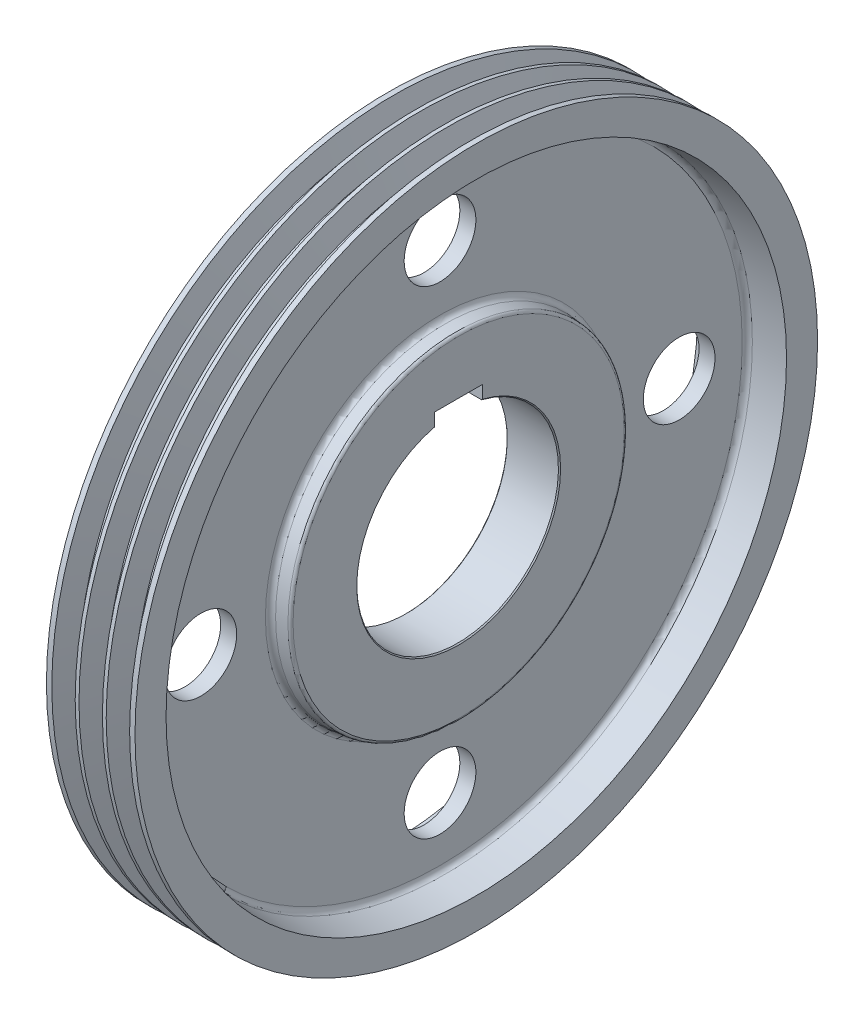
ISO-10303-21;
HEADER;
FILE_DESCRIPTION(('STEP AP214'),'2;1');
FILE_NAME('part.step','',(''),(''),'','','');
FILE_SCHEMA(('AUTOMOTIVE_DESIGN { 1 0 10303 214 1 1 1 1 }'));
ENDSEC;
DATA;
#1=APPLICATION_CONTEXT('core data for automotive mechanical design processes');
#2=APPLICATION_PROTOCOL_DEFINITION('international standard','automotive_design',2000,#1);
#3=PRODUCT_CONTEXT('',#1,'mechanical');
#4=PRODUCT('Part','Part','',(#3));
#5=PRODUCT_RELATED_PRODUCT_CATEGORY('part','',(#4));
#6=PRODUCT_DEFINITION_FORMATION('','',#4);
#7=PRODUCT_DEFINITION_CONTEXT('part definition',#1,'design');
#8=PRODUCT_DEFINITION('design','',#6,#7);
#9=PRODUCT_DEFINITION_SHAPE('','',#8);
#10=(LENGTH_UNIT() NAMED_UNIT(*) SI_UNIT(.MILLI.,.METRE.));
#11=(NAMED_UNIT(*) PLANE_ANGLE_UNIT() SI_UNIT($,.RADIAN.));
#12=(NAMED_UNIT(*) SI_UNIT($,.STERADIAN.) SOLID_ANGLE_UNIT());
#13=UNCERTAINTY_MEASURE_WITH_UNIT(LENGTH_MEASURE(1.E-05),#10,'distance_accuracy_value','');
#14=(GEOMETRIC_REPRESENTATION_CONTEXT(3) GLOBAL_UNCERTAINTY_ASSIGNED_CONTEXT((#13)) GLOBAL_UNIT_ASSIGNED_CONTEXT((#10,
#11,#12)) REPRESENTATION_CONTEXT('',''));
#15=CARTESIAN_POINT('',(0.,0.,0.));
#16=DIRECTION('',(0.,0.,1.));
#17=DIRECTION('',(1.,0.,0.));
#18=AXIS2_PLACEMENT_3D('',#15,#16,#17);
#19=CARTESIAN_POINT('',(34.,159.031051611703,0.));
#20=DIRECTION('',(1.,0.,0.));
#21=DIRECTION('',(0.,0.,-1.));
#22=AXIS2_PLACEMENT_3D('',#19,#20,#21);
#23=PLANE('',#22);
#24=CARTESIAN_POINT('',(34.,0.,0.));
#25=DIRECTION('',(1.,0.,0.));
#26=DIRECTION('',(0.,0.,-1.));
#27=AXIS2_PLACEMENT_3D('',#24,#25,#26);
#28=CIRCLE('',#27,163.612707481791);
#29=CARTESIAN_POINT('',(34.,0.,-163.612707481791));
#30=VERTEX_POINT('',#29);
#31=EDGE_CURVE('E375',#30,#30,#28,.T.);
#32=ORIENTED_EDGE('',*,*,#31,.T.);
#33=EDGE_LOOP('',(#32));
#34=FACE_BOUND('',#33,.T.);
#35=CARTESIAN_POINT('',(34.,0.,0.));
#36=DIRECTION('',(1.,0.,0.));
#37=DIRECTION('',(0.,0.,-1.));
#38=AXIS2_PLACEMENT_3D('',#35,#36,#37);
#39=CIRCLE('',#38,283.143729570031);
#40=CARTESIAN_POINT('',(34.,0.,-283.143729570031));
#41=VERTEX_POINT('',#40);
#42=EDGE_CURVE('E380',#41,#41,#39,.F.);
#43=ORIENTED_EDGE('',*,*,#42,.T.);
#44=EDGE_LOOP('',(#43));
#45=FACE_BOUND('',#44,.T.);
#46=CARTESIAN_POINT('',(34.,224.1,0.));
#47=DIRECTION('',(1.,0.,0.));
#48=DIRECTION('',(0.,0.,-1.));
#49=AXIS2_PLACEMENT_3D('',#46,#47,#48);
#50=CIRCLE('',#49,33.6);
#51=CARTESIAN_POINT('',(34.,224.1,-33.6));
#52=VERTEX_POINT('',#51);
#53=EDGE_CURVE('E403',#52,#52,#50,.F.);
#54=ORIENTED_EDGE('',*,*,#53,.F.);
#55=EDGE_LOOP('',(#54));
#56=FACE_BOUND('',#55,.T.);
#57=CARTESIAN_POINT('',(34.,-7.82440968034746E-13,-224.1));
#58=DIRECTION('',(1.,0.,0.));
#59=DIRECTION('',(0.,0.,-1.));
#60=AXIS2_PLACEMENT_3D('',#57,#58,#59);
#61=CIRCLE('',#60,33.6);
#62=CARTESIAN_POINT('',(34.,-7.82440968034746E-13,-257.7));
#63=VERTEX_POINT('',#62);
#64=EDGE_CURVE('E404',#63,#63,#61,.F.);
#65=ORIENTED_EDGE('',*,*,#64,.F.);
#66=EDGE_LOOP('',(#65));
#67=FACE_BOUND('',#66,.T.);
#68=CARTESIAN_POINT('',(34.,-224.1,1.56488193606949E-12));
#69=DIRECTION('',(1.,0.,0.));
#70=DIRECTION('',(0.,0.,-1.));
#71=AXIS2_PLACEMENT_3D('',#68,#69,#70);
#72=CIRCLE('',#71,33.6);
#73=CARTESIAN_POINT('',(34.,-224.1,-33.5999999999985));
#74=VERTEX_POINT('',#73);
#75=EDGE_CURVE('E407',#74,#74,#72,.F.);
#76=ORIENTED_EDGE('',*,*,#75,.F.);
#77=EDGE_LOOP('',(#76));
#78=FACE_BOUND('',#77,.T.);
#79=CARTESIAN_POINT('',(34.,2.34732290410424E-12,224.1));
#80=DIRECTION('',(1.,0.,0.));
#81=DIRECTION('',(0.,0.,-1.));
#82=AXIS2_PLACEMENT_3D('',#79,#80,#81);
#83=CIRCLE('',#82,33.6);
#84=CARTESIAN_POINT('',(34.,2.34732290410424E-12,190.5));
#85=VERTEX_POINT('',#84);
#86=EDGE_CURVE('E410',#85,#85,#83,.F.);
#87=ORIENTED_EDGE('',*,*,#86,.F.);
#88=EDGE_LOOP('',(#87));
#89=FACE_BOUND('',#88,.T.);
#90=ADVANCED_FACE('F39',(#34,#45,#56,#67,#78,#89),#23,.F.);
#91=CARTESIAN_POINT('',(49.,287.725385440119,0.));
#92=DIRECTION('',(-1.,0.,0.));
#93=DIRECTION('',(0.,0.,1.));
#94=AXIS2_PLACEMENT_3D('',#91,#92,#93);
#95=PLANE('',#94);
#96=CARTESIAN_POINT('',(49.,0.,0.));
#97=DIRECTION('',(-1.,0.,0.));
#98=DIRECTION('',(0.,0.,1.));
#99=AXIS2_PLACEMENT_3D('',#96,#97,#98);
#100=CIRCLE('',#99,163.612707481791);
#101=CARTESIAN_POINT('',(49.,0.,163.612707481791));
#102=VERTEX_POINT('',#101);
#103=EDGE_CURVE('E378',#102,#102,#100,.T.);
#104=ORIENTED_EDGE('',*,*,#103,.T.);
#105=EDGE_LOOP('',(#104));
#106=FACE_BOUND('',#105,.T.);
#107=CARTESIAN_POINT('',(49.,0.,0.));
#108=DIRECTION('',(-1.,0.,0.));
#109=DIRECTION('',(0.,0.,1.));
#110=AXIS2_PLACEMENT_3D('',#107,#108,#109);
#111=CIRCLE('',#110,283.143729570032);
#112=CARTESIAN_POINT('',(49.,0.,283.143729570032));
#113=VERTEX_POINT('',#112);
#114=EDGE_CURVE('E374',#113,#113,#111,.F.);
#115=ORIENTED_EDGE('',*,*,#114,.T.);
#116=EDGE_LOOP('',(#115));
#117=FACE_BOUND('',#116,.T.);
#118=CARTESIAN_POINT('',(49.,224.1,0.));
#119=DIRECTION('',(-1.,0.,0.));
#120=DIRECTION('',(0.,0.,1.));
#121=AXIS2_PLACEMENT_3D('',#118,#119,#120);
#122=CIRCLE('',#121,33.6);
#123=CARTESIAN_POINT('',(49.,224.1,33.6));
#124=VERTEX_POINT('',#123);
#125=EDGE_CURVE('E400',#124,#124,#122,.F.);
#126=ORIENTED_EDGE('',*,*,#125,.F.);
#127=EDGE_LOOP('',(#126));
#128=FACE_BOUND('',#127,.T.);
#129=CARTESIAN_POINT('',(49.,-7.82440968034746E-13,-224.1));
#130=DIRECTION('',(-1.,0.,0.));
#131=DIRECTION('',(0.,0.,1.));
#132=AXIS2_PLACEMENT_3D('',#129,#130,#131);
#133=CIRCLE('',#132,33.6);
#134=CARTESIAN_POINT('',(49.,-7.82440968034746E-13,-190.5));
#135=VERTEX_POINT('',#134);
#136=EDGE_CURVE('E405',#135,#135,#133,.F.);
#137=ORIENTED_EDGE('',*,*,#136,.F.);
#138=EDGE_LOOP('',(#137));
#139=FACE_BOUND('',#138,.T.);
#140=CARTESIAN_POINT('',(49.,-224.1,1.56488193606949E-12));
#141=DIRECTION('',(-1.,0.,0.));
#142=DIRECTION('',(0.,0.,1.));
#143=AXIS2_PLACEMENT_3D('',#140,#141,#142);
#144=CIRCLE('',#143,33.6);
#145=CARTESIAN_POINT('',(49.,-224.1,33.6000000000016));
#146=VERTEX_POINT('',#145);
#147=EDGE_CURVE('E408',#146,#146,#144,.F.);
#148=ORIENTED_EDGE('',*,*,#147,.F.);
#149=EDGE_LOOP('',(#148));
#150=FACE_BOUND('',#149,.T.);
#151=CARTESIAN_POINT('',(49.,2.34732290410424E-12,224.1));
#152=DIRECTION('',(-1.,0.,0.));
#153=DIRECTION('',(0.,0.,1.));
#154=AXIS2_PLACEMENT_3D('',#151,#152,#153);
#155=CIRCLE('',#154,33.6);
#156=CARTESIAN_POINT('',(49.,2.34732290410424E-12,257.7));
#157=VERTEX_POINT('',#156);
#158=EDGE_CURVE('E43',#157,#157,#155,.F.);
#159=ORIENTED_EDGE('',*,*,#158,.F.);
#160=EDGE_LOOP('',(#159));
#161=FACE_BOUND('',#160,.T.);
#162=ADVANCED_FACE('F196',(#106,#117,#128,#139,#150,#161),#95,.F.);
#163=CARTESIAN_POINT('',(0.,0.,0.));
#164=DIRECTION('',(-1.,0.,0.));
#165=DIRECTION('',(0.,0.,1.));
#166=AXIS2_PLACEMENT_3D('',#163,#164,#165);
#167=CYLINDRICAL_SURFACE('',#166,319.8);
#168=CARTESIAN_POINT('',(83.,0.,0.));
#169=DIRECTION('',(-1.,0.,0.));
#170=DIRECTION('',(0.,0.,1.));
#171=AXIS2_PLACEMENT_3D('',#168,#169,#170);
#172=CIRCLE('',#171,319.8);
#173=CARTESIAN_POINT('',(83.,0.,319.8));
#174=VERTEX_POINT('',#173);
#175=EDGE_CURVE('E249',#174,#174,#172,.T.);
#176=ORIENTED_EDGE('',*,*,#175,.T.);
#177=EDGE_LOOP('',(#176));
#178=FACE_BOUND('',#177,.T.);
#179=CARTESIAN_POINT('',(77.9675072710016,0.,0.));
#180=DIRECTION('',(-1.,0.,0.));
#181=DIRECTION('',(0.,0.,1.));
#182=AXIS2_PLACEMENT_3D('',#179,#180,#181);
#183=CIRCLE('',#182,319.8);
#184=CARTESIAN_POINT('',(77.9675072710016,0.,319.8));
#185=VERTEX_POINT('',#184);
#186=EDGE_CURVE('E282',#185,#185,#183,.T.);
#187=ORIENTED_EDGE('',*,*,#186,.F.);
#188=EDGE_LOOP('',(#187));
#189=FACE_BOUND('',#188,.T.);
#190=ADVANCED_FACE('F203',(#178,#189),#167,.T.);
#191=CARTESIAN_POINT('',(52.4675072710016,0.,0.));
#192=DIRECTION('',(-1.,0.,0.));
#193=DIRECTION('',(0.,0.,1.));
#194=AXIS2_PLACEMENT_3D('',#191,#192,#193);
#195=CIRCLE('',#194,319.8);
#196=CARTESIAN_POINT('',(52.4675072710016,0.,319.8));
#197=VERTEX_POINT('',#196);
#198=EDGE_CURVE('E270',#197,#197,#195,.T.);
#199=ORIENTED_EDGE('',*,*,#198,.F.);
#200=EDGE_LOOP('',(#199));
#201=FACE_BOUND('',#200,.T.);
#202=CARTESIAN_POINT('',(56.0324927289984,0.,0.));
#203=DIRECTION('',(-1.,0.,0.));
#204=DIRECTION('',(0.,0.,1.));
#205=AXIS2_PLACEMENT_3D('',#202,#203,#204);
#206=CIRCLE('',#205,319.8);
#207=CARTESIAN_POINT('',(56.0324927289984,0.,319.8));
#208=VERTEX_POINT('',#207);
#209=EDGE_CURVE('E285',#208,#208,#206,.T.);
#210=ORIENTED_EDGE('',*,*,#209,.T.);
#211=EDGE_LOOP('',(#210));
#212=FACE_BOUND('',#211,.T.);
#213=ADVANCED_FACE('F354',(#201,#212),#167,.T.);
#214=CARTESIAN_POINT('',(26.9675072710016,0.,0.));
#215=DIRECTION('',(-1.,0.,0.));
#216=DIRECTION('',(0.,0.,1.));
#217=AXIS2_PLACEMENT_3D('',#214,#215,#216);
#218=CIRCLE('',#217,319.8);
#219=CARTESIAN_POINT('',(26.9675072710016,0.,319.8));
#220=VERTEX_POINT('',#219);
#221=EDGE_CURVE('E258',#220,#220,#218,.T.);
#222=ORIENTED_EDGE('',*,*,#221,.F.);
#223=EDGE_LOOP('',(#222));
#224=FACE_BOUND('',#223,.T.);
#225=CARTESIAN_POINT('',(30.5324927289984,0.,0.));
#226=DIRECTION('',(-1.,0.,0.));
#227=DIRECTION('',(0.,0.,1.));
#228=AXIS2_PLACEMENT_3D('',#225,#226,#227);
#229=CIRCLE('',#228,319.8);
#230=CARTESIAN_POINT('',(30.5324927289984,0.,319.8));
#231=VERTEX_POINT('',#230);
#232=EDGE_CURVE('E273',#231,#231,#229,.T.);
#233=ORIENTED_EDGE('',*,*,#232,.T.);
#234=EDGE_LOOP('',(#233));
#235=FACE_BOUND('',#234,.T.);
#236=ADVANCED_FACE('F227',(#224,#235),#167,.T.);
#237=CARTESIAN_POINT('',(0.,0.,0.));
#238=DIRECTION('',(-1.,0.,0.));
#239=DIRECTION('',(0.,0.,1.));
#240=AXIS2_PLACEMENT_3D('',#237,#238,#239);
#241=CIRCLE('',#240,319.8);
#242=CARTESIAN_POINT('',(0.,0.,319.8));
#243=VERTEX_POINT('',#242);
#244=EDGE_CURVE('E246',#243,#243,#241,.T.);
#245=ORIENTED_EDGE('',*,*,#244,.F.);
#246=EDGE_LOOP('',(#245));
#247=FACE_BOUND('',#246,.T.);
#248=CARTESIAN_POINT('',(5.0324927289984,0.,0.));
#249=DIRECTION('',(-1.,0.,0.));
#250=DIRECTION('',(0.,0.,1.));
#251=AXIS2_PLACEMENT_3D('',#248,#249,#250);
#252=CIRCLE('',#251,319.8);
#253=CARTESIAN_POINT('',(5.0324927289984,0.,319.8));
#254=VERTEX_POINT('',#253);
#255=EDGE_CURVE('E261',#254,#254,#252,.T.);
#256=ORIENTED_EDGE('',*,*,#255,.T.);
#257=EDGE_LOOP('',(#256));
#258=FACE_BOUND('',#257,.T.);
#259=ADVANCED_FACE('F220',(#247,#258),#167,.T.);
#260=CARTESIAN_POINT('',(0.,0.,0.));
#261=DIRECTION('',(-1.,0.,0.));
#262=DIRECTION('',(0.,0.,1.));
#263=AXIS2_PLACEMENT_3D('',#260,#261,#262);
#264=CYLINDRICAL_SURFACE('',#263,94.5);
#265=CARTESIAN_POINT('',(17.5000000000001,0.,0.));
#266=DIRECTION('',(1.,0.,0.));
#267=DIRECTION('',(0.,0.,-1.));
#268=AXIS2_PLACEMENT_3D('',#265,#266,#267);
#269=CIRCLE('',#268,94.5);
#270=CARTESIAN_POINT('',(17.5000000000001,91.7823512446701,-22.5));
#271=VERTEX_POINT('',#270);
#272=CARTESIAN_POINT('',(17.5000000000001,91.7823512446701,22.5));
#273=VERTEX_POINT('',#272);
#274=EDGE_CURVE('E233',#271,#273,#269,.F.);
#275=ORIENTED_EDGE('',*,*,#274,.T.);
#276=DIRECTION('',(-1.,0.,0.));
#277=VECTOR('',#276,1.);
#278=CARTESIAN_POINT('',(83.,91.7823512446701,22.5));
#279=LINE('',#278,#277);
#280=CARTESIAN_POINT('',(65.5,91.7823512446701,22.5));
#281=VERTEX_POINT('',#280);
#282=EDGE_CURVE('E104',#281,#273,#279,.T.);
#283=ORIENTED_EDGE('',*,*,#282,.F.);
#284=CARTESIAN_POINT('',(65.5,0.,0.));
#285=DIRECTION('',(-1.,0.,0.));
#286=DIRECTION('',(0.,0.,1.));
#287=AXIS2_PLACEMENT_3D('',#284,#285,#286);
#288=CIRCLE('',#287,94.5);
#289=CARTESIAN_POINT('',(65.5,91.7823512446701,-22.5));
#290=VERTEX_POINT('',#289);
#291=EDGE_CURVE('E239',#281,#290,#288,.F.);
#292=ORIENTED_EDGE('',*,*,#291,.T.);
#293=DIRECTION('',(-1.,0.,0.));
#294=VECTOR('',#293,1.);
#295=CARTESIAN_POINT('',(83.,91.7823512446701,-22.5));
#296=LINE('',#295,#294);
#297=EDGE_CURVE('E117',#290,#271,#296,.T.);
#298=ORIENTED_EDGE('',*,*,#297,.T.);
#299=EDGE_LOOP('',(#275,#283,#292,#298));
#300=FACE_BOUND('',#299,.T.);
#301=ADVANCED_FACE('F217',(#300),#264,.F.);
#302=CARTESIAN_POINT('',(16.5,94.5,0.));
#303=DIRECTION('',(1.,0.,0.));
#304=DIRECTION('',(0.,0.,-1.));
#305=AXIS2_PLACEMENT_3D('',#302,#303,#304);
#306=PLANE('',#305);
#307=CARTESIAN_POINT('',(16.5,0.,0.));
#308=DIRECTION('',(1.,0.,0.));
#309=DIRECTION('',(0.,0.,-1.));
#310=AXIS2_PLACEMENT_3D('',#307,#308,#309);
#311=CIRCLE('',#310,155.209172064956);
#312=CARTESIAN_POINT('',(16.5,0.,-155.209172064956));
#313=VERTEX_POINT('',#312);
#314=EDGE_CURVE('E48',#313,#313,#311,.F.);
#315=ORIENTED_EDGE('',*,*,#314,.T.);
#316=EDGE_LOOP('',(#315));
#317=FACE_BOUND('',#316,.T.);
#318=CARTESIAN_POINT('',(16.5,0.,0.));
#319=DIRECTION('',(1.,0.,0.));
#320=DIRECTION('',(0.,0.,-1.));
#321=AXIS2_PLACEMENT_3D('',#318,#319,#320);
#322=CIRCLE('',#321,95.5000000000001);
#323=CARTESIAN_POINT('',(16.5,92.811637201377,22.5));
#324=VERTEX_POINT('',#323);
#325=CARTESIAN_POINT('',(16.5,92.811637201377,-22.5));
#326=VERTEX_POINT('',#325);
#327=EDGE_CURVE('E238',#324,#326,#322,.T.);
#328=ORIENTED_EDGE('',*,*,#327,.T.);
#329=DIRECTION('',(0.,-1.,0.));
#330=VECTOR('',#329,1.);
#331=CARTESIAN_POINT('',(16.5,91.7823512446701,-22.5));
#332=LINE('',#331,#330);
#333=CARTESIAN_POINT('',(16.5,104.89999961853,-22.5));
#334=VERTEX_POINT('',#333);
#335=EDGE_CURVE('E114',#334,#326,#332,.T.);
#336=ORIENTED_EDGE('',*,*,#335,.F.);
#337=DIRECTION('',(0.,0.,-1.));
#338=VECTOR('',#337,1.);
#339=CARTESIAN_POINT('',(16.5,104.89999961853,-22.5));
#340=LINE('',#339,#338);
#341=CARTESIAN_POINT('',(16.5,104.89999961853,22.5));
#342=VERTEX_POINT('',#341);
#343=EDGE_CURVE('E99',#342,#334,#340,.T.);
#344=ORIENTED_EDGE('',*,*,#343,.F.);
#345=DIRECTION('',(0.,1.,0.));
#346=VECTOR('',#345,1.);
#347=CARTESIAN_POINT('',(16.5,91.7823512446701,22.5));
#348=LINE('',#347,#346);
#349=EDGE_CURVE('E107',#324,#342,#348,.T.);
#350=ORIENTED_EDGE('',*,*,#349,.F.);
#351=EDGE_LOOP('',(#328,#336,#344,#350));
#352=FACE_BOUND('',#351,.T.);
#353=ADVANCED_FACE('F116',(#317,#352),#306,.F.);
#354=CARTESIAN_POINT('',(34.,0.,0.));
#355=DIRECTION('',(1.,0.,0.));
#356=DIRECTION('',(0.,0.,-1.));
#357=AXIS2_PLACEMENT_3D('',#354,#355,#356);
#358=CONICAL_SURFACE('',#357,159.031051611703,0.0872664625997021);
#359=CARTESIAN_POINT('',(18.7821106431312,0.,0.));
#360=DIRECTION('',(-1.,0.,0.));
#361=DIRECTION('',(0.,0.,1.));
#362=AXIS2_PLACEMENT_3D('',#359,#360,#361);
#363=CIRCLE('',#362,157.699658810186);
#364=CARTESIAN_POINT('',(18.7821106431312,0.,157.699658810186));
#365=VERTEX_POINT('',#364);
#366=EDGE_CURVE('E11',#365,#365,#363,.F.);
#367=ORIENTED_EDGE('',*,*,#366,.T.);
#368=EDGE_LOOP('',(#367));
#369=FACE_BOUND('',#368,.T.);
#370=CARTESIAN_POINT('',(29.4357787137382,0.,0.));
#371=DIRECTION('',(1.,0.,0.));
#372=DIRECTION('',(0.,0.,-1.));
#373=AXIS2_PLACEMENT_3D('',#370,#371,#372);
#374=CIRCLE('',#373,158.631733991332);
#375=CARTESIAN_POINT('',(29.4357787137382,0.,-158.631733991332));
#376=VERTEX_POINT('',#375);
#377=EDGE_CURVE('E710',#376,#376,#374,.F.);
#378=ORIENTED_EDGE('',*,*,#377,.T.);
#379=EDGE_LOOP('',(#378));
#380=FACE_BOUND('',#379,.T.);
#381=ADVANCED_FACE('F212',(#369,#380),#358,.T.);
#382=CARTESIAN_POINT('',(0.,0.,0.));
#383=DIRECTION('',(-1.,0.,0.));
#384=DIRECTION('',(0.,0.,1.));
#385=AXIS2_PLACEMENT_3D('',#382,#383,#384);
#386=CONICAL_SURFACE('',#385,290.7,0.0872664625997161);
#387=CARTESIAN_POINT('',(29.4357787137383,0.,0.));
#388=DIRECTION('',(-1.,0.,0.));
#389=DIRECTION('',(0.,0.,1.));
#390=AXIS2_PLACEMENT_3D('',#387,#388,#389);
#391=CIRCLE('',#390,288.12470306049);
#392=CARTESIAN_POINT('',(29.4357787137383,0.,288.12470306049));
#393=VERTEX_POINT('',#392);
#394=EDGE_CURVE('E373',#393,#393,#391,.F.);
#395=ORIENTED_EDGE('',*,*,#394,.T.);
#396=EDGE_LOOP('',(#395));
#397=FACE_BOUND('',#396,.T.);
#398=CARTESIAN_POINT('',(0.,0.,0.));
#399=DIRECTION('',(-1.,0.,0.));
#400=DIRECTION('',(0.,0.,1.));
#401=AXIS2_PLACEMENT_3D('',#398,#399,#400);
#402=CIRCLE('',#401,290.7);
#403=CARTESIAN_POINT('',(0.,0.,290.7));
#404=VERTEX_POINT('',#403);
#405=EDGE_CURVE('E241',#404,#404,#402,.T.);
#406=ORIENTED_EDGE('',*,*,#405,.T.);
#407=EDGE_LOOP('',(#406));
#408=FACE_BOUND('',#407,.T.);
#409=ADVANCED_FACE('F210',(#397,#408),#386,.F.);
#410=CARTESIAN_POINT('',(0.,290.7,0.));
#411=DIRECTION('',(1.,0.,0.));
#412=DIRECTION('',(0.,0.,-1.));
#413=AXIS2_PLACEMENT_3D('',#410,#411,#412);
#414=PLANE('',#413);
#415=ORIENTED_EDGE('',*,*,#405,.F.);
#416=EDGE_LOOP('',(#415));
#417=FACE_BOUND('',#416,.T.);
#418=ORIENTED_EDGE('',*,*,#244,.T.);
#419=EDGE_LOOP('',(#418));
#420=FACE_BOUND('',#419,.T.);
#421=ADVANCED_FACE('F351',(#417,#420),#414,.F.);
#422=CARTESIAN_POINT('',(83.,319.8,0.));
#423=DIRECTION('',(-1.,0.,0.));
#424=DIRECTION('',(0.,0.,1.));
#425=AXIS2_PLACEMENT_3D('',#422,#423,#424);
#426=PLANE('',#425);
#427=ORIENTED_EDGE('',*,*,#175,.F.);
#428=EDGE_LOOP('',(#427));
#429=FACE_BOUND('',#428,.T.);
#430=CARTESIAN_POINT('',(83.,0.,0.));
#431=DIRECTION('',(-1.,0.,0.));
#432=DIRECTION('',(0.,0.,1.));
#433=AXIS2_PLACEMENT_3D('',#430,#431,#432);
#434=CIRCLE('',#433,290.7);
#435=CARTESIAN_POINT('',(83.,0.,290.7));
#436=VERTEX_POINT('',#435);
#437=EDGE_CURVE('E252',#436,#436,#434,.T.);
#438=ORIENTED_EDGE('',*,*,#437,.T.);
#439=EDGE_LOOP('',(#438));
#440=FACE_BOUND('',#439,.T.);
#441=ADVANCED_FACE('F348',(#429,#440),#426,.F.);
#442=CARTESIAN_POINT('',(49.,0.,0.));
#443=DIRECTION('',(1.,0.,0.));
#444=DIRECTION('',(0.,0.,-1.));
#445=AXIS2_PLACEMENT_3D('',#442,#443,#444);
#446=CONICAL_SURFACE('',#445,287.725385440119,0.0872664625997015);
#447=CARTESIAN_POINT('',(53.5642212862618,0.,0.));
#448=DIRECTION('',(1.,0.,0.));
#449=DIRECTION('',(0.,0.,-1.));
#450=AXIS2_PLACEMENT_3D('',#447,#448,#449);
#451=CIRCLE('',#450,288.124703060491);
#452=CARTESIAN_POINT('',(53.5642212862618,0.,-288.124703060491));
#453=VERTEX_POINT('',#452);
#454=EDGE_CURVE('E389',#453,#453,#451,.F.);
#455=ORIENTED_EDGE('',*,*,#454,.T.);
#456=EDGE_LOOP('',(#455));
#457=FACE_BOUND('',#456,.T.);
#458=ORIENTED_EDGE('',*,*,#437,.F.);
#459=EDGE_LOOP('',(#458));
#460=FACE_BOUND('',#459,.T.);
#461=ADVANCED_FACE('F343',(#457,#460),#446,.F.);
#462=CARTESIAN_POINT('',(66.5,0.,0.));
#463=DIRECTION('',(-1.,0.,0.));
#464=DIRECTION('',(0.,0.,1.));
#465=AXIS2_PLACEMENT_3D('',#462,#463,#464);
#466=CONICAL_SURFACE('',#465,157.5,0.0872664625997162);
#467=CARTESIAN_POINT('',(64.2178893568692,0.,0.));
#468=DIRECTION('',(1.,0.,0.));
#469=DIRECTION('',(0.,0.,-1.));
#470=AXIS2_PLACEMENT_3D('',#467,#468,#469);
#471=CIRCLE('',#470,157.699658810186);
#472=CARTESIAN_POINT('',(64.2178893568692,0.,-157.699658810186));
#473=VERTEX_POINT('',#472);
#474=EDGE_CURVE('E392',#473,#473,#471,.F.);
#475=ORIENTED_EDGE('',*,*,#474,.T.);
#476=EDGE_LOOP('',(#475));
#477=FACE_BOUND('',#476,.T.);
#478=CARTESIAN_POINT('',(53.5642212862617,0.,0.));
#479=DIRECTION('',(-1.,0.,0.));
#480=DIRECTION('',(0.,0.,1.));
#481=AXIS2_PLACEMENT_3D('',#478,#479,#480);
#482=CIRCLE('',#481,158.631733991332);
#483=CARTESIAN_POINT('',(53.5642212862617,0.,158.631733991332));
#484=VERTEX_POINT('',#483);
#485=EDGE_CURVE('E386',#484,#484,#482,.F.);
#486=ORIENTED_EDGE('',*,*,#485,.T.);
#487=EDGE_LOOP('',(#486));
#488=FACE_BOUND('',#487,.T.);
#489=ADVANCED_FACE('F340',(#477,#488),#466,.T.);
#490=CARTESIAN_POINT('',(66.5,157.5,0.));
#491=DIRECTION('',(-1.,0.,0.));
#492=DIRECTION('',(0.,0.,1.));
#493=AXIS2_PLACEMENT_3D('',#490,#491,#492);
#494=PLANE('',#493);
#495=CARTESIAN_POINT('',(66.5,0.,0.));
#496=DIRECTION('',(-1.,0.,0.));
#497=DIRECTION('',(0.,0.,1.));
#498=AXIS2_PLACEMENT_3D('',#495,#496,#497);
#499=CIRCLE('',#498,155.209172064956);
#500=CARTESIAN_POINT('',(66.5,0.,155.209172064956));
#501=VERTEX_POINT('',#500);
#502=EDGE_CURVE('E395',#501,#501,#499,.F.);
#503=ORIENTED_EDGE('',*,*,#502,.T.);
#504=EDGE_LOOP('',(#503));
#505=FACE_BOUND('',#504,.T.);
#506=DIRECTION('',(0.,0.,-1.));
#507=VECTOR('',#506,1.);
#508=CARTESIAN_POINT('',(66.5,104.89999961853,0.));
#509=LINE('',#508,#507);
#510=CARTESIAN_POINT('',(66.5,104.89999961853,22.5));
#511=VERTEX_POINT('',#510);
#512=CARTESIAN_POINT('',(66.5,104.89999961853,-22.5));
#513=VERTEX_POINT('',#512);
#514=EDGE_CURVE('E102',#511,#513,#509,.T.);
#515=ORIENTED_EDGE('',*,*,#514,.T.);
#516=DIRECTION('',(0.,-1.,0.));
#517=VECTOR('',#516,1.);
#518=CARTESIAN_POINT('',(66.5,157.5,-22.5));
#519=LINE('',#518,#517);
#520=CARTESIAN_POINT('',(66.5,92.8116372013769,-22.5));
#521=VERTEX_POINT('',#520);
#522=EDGE_CURVE('E133',#513,#521,#519,.T.);
#523=ORIENTED_EDGE('',*,*,#522,.T.);
#524=CARTESIAN_POINT('',(66.5,0.,0.));
#525=DIRECTION('',(-1.,0.,0.));
#526=DIRECTION('',(0.,0.,1.));
#527=AXIS2_PLACEMENT_3D('',#524,#525,#526);
#528=CIRCLE('',#527,95.5);
#529=CARTESIAN_POINT('',(66.5,92.8116372013769,22.5));
#530=VERTEX_POINT('',#529);
#531=EDGE_CURVE('E157',#521,#530,#528,.T.);
#532=ORIENTED_EDGE('',*,*,#531,.T.);
#533=DIRECTION('',(0.,1.,0.));
#534=VECTOR('',#533,1.);
#535=CARTESIAN_POINT('',(66.5,157.5,22.5));
#536=LINE('',#535,#534);
#537=EDGE_CURVE('E56',#530,#511,#536,.T.);
#538=ORIENTED_EDGE('',*,*,#537,.T.);
#539=EDGE_LOOP('',(#515,#523,#532,#538));
#540=FACE_BOUND('',#539,.T.);
#541=ADVANCED_FACE('F298',(#505,#540),#494,.F.);
#542=CARTESIAN_POINT('',(0.,0.,0.));
#543=DIRECTION('',(-1.,0.,0.));
#544=DIRECTION('',(0.,0.,1.));
#545=AXIS2_PLACEMENT_3D('',#542,#543,#544);
#546=CYLINDRICAL_SURFACE('',#545,300.7);
#547=CARTESIAN_POINT('',(21.1280512551412,0.,0.));
#548=DIRECTION('',(-1.,0.,0.));
#549=DIRECTION('',(0.,0.,1.));
#550=AXIS2_PLACEMENT_3D('',#547,#548,#549);
#551=CIRCLE('',#550,300.7);
#552=CARTESIAN_POINT('',(21.1280512551412,0.,300.7));
#553=VERTEX_POINT('',#552);
#554=EDGE_CURVE('E255',#553,#553,#551,.T.);
#555=ORIENTED_EDGE('',*,*,#554,.T.);
#556=EDGE_LOOP('',(#555));
#557=FACE_BOUND('',#556,.T.);
#558=CARTESIAN_POINT('',(10.8719487448588,0.,0.));
#559=DIRECTION('',(-1.,0.,0.));
#560=DIRECTION('',(0.,0.,1.));
#561=AXIS2_PLACEMENT_3D('',#558,#559,#560);
#562=CIRCLE('',#561,300.7);
#563=CARTESIAN_POINT('',(10.8719487448588,0.,300.7));
#564=VERTEX_POINT('',#563);
#565=EDGE_CURVE('E264',#564,#564,#562,.T.);
#566=ORIENTED_EDGE('',*,*,#565,.F.);
#567=EDGE_LOOP('',(#566));
#568=FACE_BOUND('',#567,.T.);
#569=ADVANCED_FACE('F334',(#557,#568),#546,.T.);
#570=CARTESIAN_POINT('',(21.1280512551412,0.,0.));
#571=DIRECTION('',(1.,0.,0.));
#572=DIRECTION('',(0.,0.,-1.));
#573=AXIS2_PLACEMENT_3D('',#570,#571,#572);
#574=CONICAL_SURFACE('',#573,300.7,1.27409035395586);
#575=ORIENTED_EDGE('',*,*,#221,.T.);
#576=EDGE_LOOP('',(#575));
#577=FACE_BOUND('',#576,.T.);
#578=ORIENTED_EDGE('',*,*,#554,.F.);
#579=EDGE_LOOP('',(#578));
#580=FACE_BOUND('',#579,.T.);
#581=ADVANCED_FACE('F330',(#577,#580),#574,.T.);
#582=CARTESIAN_POINT('',(5.0324927289984,0.,0.));
#583=DIRECTION('',(-1.,0.,0.));
#584=DIRECTION('',(0.,0.,1.));
#585=AXIS2_PLACEMENT_3D('',#582,#583,#584);
#586=CONICAL_SURFACE('',#585,319.8,1.27409035395586);
#587=ORIENTED_EDGE('',*,*,#565,.T.);
#588=EDGE_LOOP('',(#587));
#589=FACE_BOUND('',#588,.T.);
#590=ORIENTED_EDGE('',*,*,#255,.F.);
#591=EDGE_LOOP('',(#590));
#592=FACE_BOUND('',#591,.T.);
#593=ADVANCED_FACE('F326',(#589,#592),#586,.T.);
#594=CARTESIAN_POINT('',(25.5,0.,0.));
#595=DIRECTION('',(-1.,0.,0.));
#596=DIRECTION('',(0.,0.,1.));
#597=AXIS2_PLACEMENT_3D('',#594,#595,#596);
#598=CYLINDRICAL_SURFACE('',#597,300.7);
#599=CARTESIAN_POINT('',(46.6280512551412,0.,0.));
#600=DIRECTION('',(-1.,0.,0.));
#601=DIRECTION('',(0.,0.,1.));
#602=AXIS2_PLACEMENT_3D('',#599,#600,#601);
#603=CIRCLE('',#602,300.7);
#604=CARTESIAN_POINT('',(46.6280512551412,0.,300.7));
#605=VERTEX_POINT('',#604);
#606=EDGE_CURVE('E267',#605,#605,#603,.T.);
#607=ORIENTED_EDGE('',*,*,#606,.T.);
#608=EDGE_LOOP('',(#607));
#609=FACE_BOUND('',#608,.T.);
#610=CARTESIAN_POINT('',(36.3719487448588,0.,0.));
#611=DIRECTION('',(-1.,0.,0.));
#612=DIRECTION('',(0.,0.,1.));
#613=AXIS2_PLACEMENT_3D('',#610,#611,#612);
#614=CIRCLE('',#613,300.7);
#615=CARTESIAN_POINT('',(36.3719487448588,0.,300.7));
#616=VERTEX_POINT('',#615);
#617=EDGE_CURVE('E276',#616,#616,#614,.T.);
#618=ORIENTED_EDGE('',*,*,#617,.F.);
#619=EDGE_LOOP('',(#618));
#620=FACE_BOUND('',#619,.T.);
#621=ADVANCED_FACE('F322',(#609,#620),#598,.T.);
#622=CARTESIAN_POINT('',(46.6280512551412,0.,0.));
#623=DIRECTION('',(1.,0.,0.));
#624=DIRECTION('',(0.,0.,-1.));
#625=AXIS2_PLACEMENT_3D('',#622,#623,#624);
#626=CONICAL_SURFACE('',#625,300.7,1.27409035395586);
#627=ORIENTED_EDGE('',*,*,#198,.T.);
#628=EDGE_LOOP('',(#627));
#629=FACE_BOUND('',#628,.T.);
#630=ORIENTED_EDGE('',*,*,#606,.F.);
#631=EDGE_LOOP('',(#630));
#632=FACE_BOUND('',#631,.T.);
#633=ADVANCED_FACE('F318',(#629,#632),#626,.T.);
#634=CARTESIAN_POINT('',(30.5324927289984,0.,0.));
#635=DIRECTION('',(-1.,0.,0.));
#636=DIRECTION('',(0.,0.,1.));
#637=AXIS2_PLACEMENT_3D('',#634,#635,#636);
#638=CONICAL_SURFACE('',#637,319.8,1.27409035395586);
#639=ORIENTED_EDGE('',*,*,#617,.T.);
#640=EDGE_LOOP('',(#639));
#641=FACE_BOUND('',#640,.T.);
#642=ORIENTED_EDGE('',*,*,#232,.F.);
#643=EDGE_LOOP('',(#642));
#644=FACE_BOUND('',#643,.T.);
#645=ADVANCED_FACE('F314',(#641,#644),#638,.T.);
#646=CARTESIAN_POINT('',(51.,0.,0.));
#647=DIRECTION('',(-1.,0.,0.));
#648=DIRECTION('',(0.,0.,1.));
#649=AXIS2_PLACEMENT_3D('',#646,#647,#648);
#650=CYLINDRICAL_SURFACE('',#649,300.7);
#651=CARTESIAN_POINT('',(72.1280512551412,0.,0.));
#652=DIRECTION('',(-1.,0.,0.));
#653=DIRECTION('',(0.,0.,1.));
#654=AXIS2_PLACEMENT_3D('',#651,#652,#653);
#655=CIRCLE('',#654,300.7);
#656=CARTESIAN_POINT('',(72.1280512551412,0.,300.7));
#657=VERTEX_POINT('',#656);
#658=EDGE_CURVE('E279',#657,#657,#655,.T.);
#659=ORIENTED_EDGE('',*,*,#658,.T.);
#660=EDGE_LOOP('',(#659));
#661=FACE_BOUND('',#660,.T.);
#662=CARTESIAN_POINT('',(61.8719487448588,0.,0.));
#663=DIRECTION('',(-1.,0.,0.));
#664=DIRECTION('',(0.,0.,1.));
#665=AXIS2_PLACEMENT_3D('',#662,#663,#664);
#666=CIRCLE('',#665,300.7);
#667=CARTESIAN_POINT('',(61.8719487448588,0.,300.7));
#668=VERTEX_POINT('',#667);
#669=EDGE_CURVE('E288',#668,#668,#666,.T.);
#670=ORIENTED_EDGE('',*,*,#669,.F.);
#671=EDGE_LOOP('',(#670));
#672=FACE_BOUND('',#671,.T.);
#673=ADVANCED_FACE('F307',(#661,#672),#650,.T.);
#674=CARTESIAN_POINT('',(72.1280512551412,0.,0.));
#675=DIRECTION('',(1.,0.,0.));
#676=DIRECTION('',(0.,0.,-1.));
#677=AXIS2_PLACEMENT_3D('',#674,#675,#676);
#678=CONICAL_SURFACE('',#677,300.7,1.27409035395586);
#679=ORIENTED_EDGE('',*,*,#186,.T.);
#680=EDGE_LOOP('',(#679));
#681=FACE_BOUND('',#680,.T.);
#682=ORIENTED_EDGE('',*,*,#658,.F.);
#683=EDGE_LOOP('',(#682));
#684=FACE_BOUND('',#683,.T.);
#685=ADVANCED_FACE('F302',(#681,#684),#678,.T.);
#686=CARTESIAN_POINT('',(56.0324927289984,0.,0.));
#687=DIRECTION('',(-1.,0.,0.));
#688=DIRECTION('',(0.,0.,1.));
#689=AXIS2_PLACEMENT_3D('',#686,#687,#688);
#690=CONICAL_SURFACE('',#689,319.8,1.27409035395586);
#691=ORIENTED_EDGE('',*,*,#669,.T.);
#692=EDGE_LOOP('',(#691));
#693=FACE_BOUND('',#692,.T.);
#694=ORIENTED_EDGE('',*,*,#209,.F.);
#695=EDGE_LOOP('',(#694));
#696=FACE_BOUND('',#695,.T.);
#697=ADVANCED_FACE('F299',(#693,#696),#690,.T.);
#698=CARTESIAN_POINT('',(17.5000000000001,0.,0.));
#699=DIRECTION('',(-1.,0.,0.));
#700=DIRECTION('',(0.,0.,1.));
#701=AXIS2_PLACEMENT_3D('',#698,#699,#700);
#702=CONICAL_SURFACE('',#701,94.5,0.785398163397455);
#703=CARTESIAN_POINT('',(11.9108630440765,97.5273568624807,-22.5));
#704=CARTESIAN_POINT('',(12.7638469726146,96.6519655371082,-22.5));
#705=CARTESIAN_POINT('',(13.6165350394658,95.7762858473822,-22.5));
#706=CARTESIAN_POINT('',(15.32126487843,94.0242987167132,-22.5));
#707=CARTESIAN_POINT('',(16.1733066509587,93.1479912761746,-22.5));
#708=CARTESIAN_POINT('',(17.8766905116704,91.3946964085921,-22.5));
#709=CARTESIAN_POINT('',(18.7280325997849,90.5177089814817,-22.5));
#710=CARTESIAN_POINT('',(20.4299536307068,88.7629928644472,-22.5));
#711=CARTESIAN_POINT('',(21.2805325730223,87.885264174046,-22.5));
#712=CARTESIAN_POINT('',(22.1306977054104,87.0071347357005,-22.5));
#713=B_SPLINE_CURVE_WITH_KNOTS('',3,(#703,#704,#705,#706,#707,#708,#709,#710,#711,#712),
.UNSPECIFIED.,.F.,.F.,(4,2,2,2,4),(0.,3.66674570331372,7.33348904609357,11.0002327478025,
14.6669788107852),.UNSPECIFIED.);
#714=EDGE_CURVE('E290',#326,#271,#713,.T.);
#715=ORIENTED_EDGE('',*,*,#714,.F.);
#716=ORIENTED_EDGE('',*,*,#327,.F.);
#717=CARTESIAN_POINT('',(22.1306977054104,87.0071347357005,22.5));
#718=CARTESIAN_POINT('',(21.2805325730223,87.885264174046,22.5));
#719=CARTESIAN_POINT('',(20.4299536307068,88.7629928644472,22.5));
#720=CARTESIAN_POINT('',(18.7280325997849,90.5177089814817,22.5));
#721=CARTESIAN_POINT('',(17.8766905116704,91.3946964085921,22.5));
#722=CARTESIAN_POINT('',(16.1733066509587,93.1479912761746,22.5));
#723=CARTESIAN_POINT('',(15.32126487843,94.0242987167132,22.5));
#724=CARTESIAN_POINT('',(13.6165350394658,95.7762858473822,22.5));
#725=CARTESIAN_POINT('',(12.7638469726146,96.6519655371082,22.5));
#726=CARTESIAN_POINT('',(11.9108630440765,97.5273568624807,22.5));
#727=B_SPLINE_CURVE_WITH_KNOTS('',3,(#717,#718,#719,#720,#721,#722,#723,#724,#725,#726),
.UNSPECIFIED.,.F.,.F.,(4,2,2,2,4),(0.,3.66674606298275,7.33348976469166,11.0002331074715,
14.6669788107852),.UNSPECIFIED.);
#728=EDGE_CURVE('E110',#273,#324,#727,.T.);
#729=ORIENTED_EDGE('',*,*,#728,.F.);
#730=ORIENTED_EDGE('',*,*,#274,.F.);
#731=EDGE_LOOP('',(#715,#716,#729,#730));
#732=FACE_BOUND('',#731,.T.);
#733=ADVANCED_FACE('F135',(#732),#702,.F.);
#734=CARTESIAN_POINT('',(66.5,0.,0.));
#735=DIRECTION('',(1.,0.,0.));
#736=DIRECTION('',(0.,0.,-1.));
#737=AXIS2_PLACEMENT_3D('',#734,#735,#736);
#738=CONICAL_SURFACE('',#737,95.5,0.785398163397448);
#739=CARTESIAN_POINT('',(60.8693022945898,87.0071347357007,-22.5));
#740=CARTESIAN_POINT('',(61.7194674269779,87.8852641740462,-22.5));
#741=CARTESIAN_POINT('',(62.5700463692934,88.7629928644473,-22.5));
#742=CARTESIAN_POINT('',(64.2719674002152,90.5177089814818,-22.5));
#743=CARTESIAN_POINT('',(65.1233094883298,91.3946964085921,-22.5));
#744=CARTESIAN_POINT('',(66.8266933490414,93.1479912761745,-22.5));
#745=CARTESIAN_POINT('',(67.67873512157,94.024298716713,-22.5));
#746=CARTESIAN_POINT('',(69.3834649605341,95.776285847382,-22.5));
#747=CARTESIAN_POINT('',(70.2361530273853,96.651965537108,-22.5));
#748=CARTESIAN_POINT('',(71.0891369559234,97.5273568624804,-22.5));
#749=B_SPLINE_CURVE_WITH_KNOTS('',3,(#739,#740,#741,#742,#743,#744,#745,#746,#747,#748),
.UNSPECIFIED.,.F.,.F.,(4,2,2,2,4),(0.,3.66674606298261,7.33348976469135,11.000233107471,
14.6669788107846),.UNSPECIFIED.);
#750=EDGE_CURVE('E64',#290,#521,#749,.T.);
#751=ORIENTED_EDGE('',*,*,#750,.F.);
#752=ORIENTED_EDGE('',*,*,#291,.F.);
#753=CARTESIAN_POINT('',(71.0891369559234,97.5273568624804,22.5));
#754=CARTESIAN_POINT('',(70.2361530273853,96.651965537108,22.5));
#755=CARTESIAN_POINT('',(69.3834649605341,95.776285847382,22.5));
#756=CARTESIAN_POINT('',(67.67873512157,94.024298716713,22.5));
#757=CARTESIAN_POINT('',(66.8266933490414,93.1479912761745,22.5));
#758=CARTESIAN_POINT('',(65.1233094883297,91.3946964085921,22.5));
#759=CARTESIAN_POINT('',(64.2719674002152,90.5177089814818,22.5));
#760=CARTESIAN_POINT('',(62.5700463692934,88.7629928644473,22.5));
#761=CARTESIAN_POINT('',(61.7194674269779,87.8852641740462,22.5));
#762=CARTESIAN_POINT('',(60.8693022945898,87.0071347357007,22.5));
#763=B_SPLINE_CURVE_WITH_KNOTS('',3,(#753,#754,#755,#756,#757,#758,#759,#760,#761,#762),
.UNSPECIFIED.,.F.,.F.,(4,2,2,2,4),(0.,3.66674570331357,7.33348904609327,11.000232747802,
14.6669788107846),.UNSPECIFIED.);
#764=EDGE_CURVE('E150',#530,#281,#763,.T.);
#765=ORIENTED_EDGE('',*,*,#764,.F.);
#766=ORIENTED_EDGE('',*,*,#531,.F.);
#767=EDGE_LOOP('',(#751,#752,#765,#766));
#768=FACE_BOUND('',#767,.T.);
#769=ADVANCED_FACE('F164',(#768),#738,.F.);
#770=CARTESIAN_POINT('',(83.,104.89999961853,-22.5));
#771=DIRECTION('',(0.,1.,0.));
#772=DIRECTION('',(0.,0.,1.));
#773=AXIS2_PLACEMENT_3D('',#770,#771,#772);
#774=PLANE('',#773);
#775=DIRECTION('',(-1.,0.,0.));
#776=VECTOR('',#775,1.);
#777=CARTESIAN_POINT('',(83.,104.89999961853,22.5));
#778=LINE('',#777,#776);
#779=EDGE_CURVE('E94',#511,#342,#778,.T.);
#780=ORIENTED_EDGE('',*,*,#779,.T.);
#781=ORIENTED_EDGE('',*,*,#343,.T.);
#782=DIRECTION('',(-1.,0.,0.));
#783=VECTOR('',#782,1.);
#784=CARTESIAN_POINT('',(83.,104.89999961853,-22.5));
#785=LINE('',#784,#783);
#786=EDGE_CURVE('E103',#513,#334,#785,.T.);
#787=ORIENTED_EDGE('',*,*,#786,.F.);
#788=ORIENTED_EDGE('',*,*,#514,.F.);
#789=EDGE_LOOP('',(#780,#781,#787,#788));
#790=FACE_BOUND('',#789,.T.);
#791=ADVANCED_FACE('F96',(#790),#774,.F.);
#792=CARTESIAN_POINT('',(83.,91.7823512446701,-22.5));
#793=DIRECTION('',(0.,0.,-1.));
#794=DIRECTION('',(-1.,0.,0.));
#795=AXIS2_PLACEMENT_3D('',#792,#793,#794);
#796=PLANE('',#795);
#797=ORIENTED_EDGE('',*,*,#714,.T.);
#798=ORIENTED_EDGE('',*,*,#297,.F.);
#799=ORIENTED_EDGE('',*,*,#750,.T.);
#800=ORIENTED_EDGE('',*,*,#522,.F.);
#801=ORIENTED_EDGE('',*,*,#786,.T.);
#802=ORIENTED_EDGE('',*,*,#335,.T.);
#803=EDGE_LOOP('',(#797,#798,#799,#800,#801,#802));
#804=FACE_BOUND('',#803,.T.);
#805=ADVANCED_FACE('F144',(#804),#796,.F.);
#806=CARTESIAN_POINT('',(83.,91.7823512446701,22.5));
#807=DIRECTION('',(0.,0.,1.));
#808=DIRECTION('',(1.,0.,0.));
#809=AXIS2_PLACEMENT_3D('',#806,#807,#808);
#810=PLANE('',#809);
#811=ORIENTED_EDGE('',*,*,#728,.T.);
#812=ORIENTED_EDGE('',*,*,#349,.T.);
#813=ORIENTED_EDGE('',*,*,#779,.F.);
#814=ORIENTED_EDGE('',*,*,#537,.F.);
#815=ORIENTED_EDGE('',*,*,#764,.T.);
#816=ORIENTED_EDGE('',*,*,#282,.T.);
#817=EDGE_LOOP('',(#811,#812,#813,#814,#815,#816));
#818=FACE_BOUND('',#817,.T.);
#819=ADVANCED_FACE('F108',(#818),#810,.F.);
#820=CARTESIAN_POINT('',(29.,0.,0.));
#821=DIRECTION('',(1.,0.,0.));
#822=DIRECTION('',(0.,0.,-1.));
#823=AXIS2_PLACEMENT_3D('',#820,#821,#822);
#824=TOROIDAL_SURFACE('',#823,163.612707481791,5.);
#825=ORIENTED_EDGE('',*,*,#31,.F.);
#826=EDGE_LOOP('',(#825));
#827=FACE_BOUND('',#826,.T.);
#828=ORIENTED_EDGE('',*,*,#377,.F.);
#829=EDGE_LOOP('',(#828));
#830=FACE_BOUND('',#829,.T.);
#831=ADVANCED_FACE('F143',(#827,#830),#824,.F.);
#832=CARTESIAN_POINT('',(29.,0.,0.));
#833=DIRECTION('',(1.,0.,0.));
#834=DIRECTION('',(0.,0.,-1.));
#835=AXIS2_PLACEMENT_3D('',#832,#833,#834);
#836=TOROIDAL_SURFACE('',#835,283.143729570031,5.);
#837=ORIENTED_EDGE('',*,*,#394,.F.);
#838=EDGE_LOOP('',(#837));
#839=FACE_BOUND('',#838,.T.);
#840=ORIENTED_EDGE('',*,*,#42,.F.);
#841=EDGE_LOOP('',(#840));
#842=FACE_BOUND('',#841,.T.);
#843=ADVANCED_FACE('F172',(#839,#842),#836,.F.);
#844=CARTESIAN_POINT('',(54.,0.,0.));
#845=DIRECTION('',(-1.,0.,0.));
#846=DIRECTION('',(0.,0.,1.));
#847=AXIS2_PLACEMENT_3D('',#844,#845,#846);
#848=TOROIDAL_SURFACE('',#847,163.612707481791,5.);
#849=ORIENTED_EDGE('',*,*,#485,.F.);
#850=EDGE_LOOP('',(#849));
#851=FACE_BOUND('',#850,.T.);
#852=ORIENTED_EDGE('',*,*,#103,.F.);
#853=EDGE_LOOP('',(#852));
#854=FACE_BOUND('',#853,.T.);
#855=ADVANCED_FACE('F176',(#851,#854),#848,.F.);
#856=CARTESIAN_POINT('',(54.,0.,0.));
#857=DIRECTION('',(-1.,0.,0.));
#858=DIRECTION('',(0.,0.,1.));
#859=AXIS2_PLACEMENT_3D('',#856,#857,#858);
#860=TOROIDAL_SURFACE('',#859,283.143729570032,5.);
#861=ORIENTED_EDGE('',*,*,#114,.F.);
#862=EDGE_LOOP('',(#861));
#863=FACE_BOUND('',#862,.T.);
#864=ORIENTED_EDGE('',*,*,#454,.F.);
#865=EDGE_LOOP('',(#864));
#866=FACE_BOUND('',#865,.T.);
#867=ADVANCED_FACE('F180',(#863,#866),#860,.F.);
#868=CARTESIAN_POINT('',(64.,0.,0.));
#869=DIRECTION('',(-1.,0.,0.));
#870=DIRECTION('',(0.,0.,1.));
#871=AXIS2_PLACEMENT_3D('',#868,#869,#870);
#872=TOROIDAL_SURFACE('',#871,155.209172064956,2.5);
#873=ORIENTED_EDGE('',*,*,#502,.F.);
#874=EDGE_LOOP('',(#873));
#875=FACE_BOUND('',#874,.T.);
#876=ORIENTED_EDGE('',*,*,#474,.F.);
#877=EDGE_LOOP('',(#876));
#878=FACE_BOUND('',#877,.T.);
#879=ADVANCED_FACE('F183',(#875,#878),#872,.T.);
#880=CARTESIAN_POINT('',(19.,0.,0.));
#881=DIRECTION('',(1.,0.,0.));
#882=DIRECTION('',(0.,0.,-1.));
#883=AXIS2_PLACEMENT_3D('',#880,#881,#882);
#884=TOROIDAL_SURFACE('',#883,155.209172064956,2.5);
#885=ORIENTED_EDGE('',*,*,#366,.F.);
#886=EDGE_LOOP('',(#885));
#887=FACE_BOUND('',#886,.T.);
#888=ORIENTED_EDGE('',*,*,#314,.F.);
#889=EDGE_LOOP('',(#888));
#890=FACE_BOUND('',#889,.T.);
#891=ADVANCED_FACE('F41',(#887,#890),#884,.T.);
#892=CARTESIAN_POINT('',(83.,224.1,0.));
#893=DIRECTION('',(-1.,0.,0.));
#894=DIRECTION('',(0.,0.,1.));
#895=AXIS2_PLACEMENT_3D('',#892,#893,#894);
#896=CYLINDRICAL_SURFACE('',#895,33.6);
#897=ORIENTED_EDGE('',*,*,#125,.T.);
#898=EDGE_LOOP('',(#897));
#899=FACE_BOUND('',#898,.T.);
#900=ORIENTED_EDGE('',*,*,#53,.T.);
#901=EDGE_LOOP('',(#900));
#902=FACE_BOUND('',#901,.T.);
#903=ADVANCED_FACE('F191',(#899,#902),#896,.F.);
#904=CARTESIAN_POINT('',(83.,-7.82440968034746E-13,-224.1));
#905=DIRECTION('',(-1.,0.,0.));
#906=DIRECTION('',(0.,0.,1.));
#907=AXIS2_PLACEMENT_3D('',#904,#905,#906);
#908=CYLINDRICAL_SURFACE('',#907,33.6);
#909=ORIENTED_EDGE('',*,*,#136,.T.);
#910=EDGE_LOOP('',(#909));
#911=FACE_BOUND('',#910,.T.);
#912=ORIENTED_EDGE('',*,*,#64,.T.);
#913=EDGE_LOOP('',(#912));
#914=FACE_BOUND('',#913,.T.);
#915=ADVANCED_FACE('F616',(#911,#914),#908,.F.);
#916=CARTESIAN_POINT('',(83.,-224.1,1.56488193606949E-12));
#917=DIRECTION('',(-1.,0.,0.));
#918=DIRECTION('',(0.,0.,1.));
#919=AXIS2_PLACEMENT_3D('',#916,#917,#918);
#920=CYLINDRICAL_SURFACE('',#919,33.6);
#921=ORIENTED_EDGE('',*,*,#147,.T.);
#922=EDGE_LOOP('',(#921));
#923=FACE_BOUND('',#922,.T.);
#924=ORIENTED_EDGE('',*,*,#75,.T.);
#925=EDGE_LOOP('',(#924));
#926=FACE_BOUND('',#925,.T.);
#927=ADVANCED_FACE('F633',(#923,#926),#920,.F.);
#928=CARTESIAN_POINT('',(83.,2.34732290410424E-12,224.1));
#929=DIRECTION('',(-1.,0.,0.));
#930=DIRECTION('',(0.,0.,1.));
#931=AXIS2_PLACEMENT_3D('',#928,#929,#930);
#932=CYLINDRICAL_SURFACE('',#931,33.6);
#933=ORIENTED_EDGE('',*,*,#158,.T.);
#934=EDGE_LOOP('',(#933));
#935=FACE_BOUND('',#934,.T.);
#936=ORIENTED_EDGE('',*,*,#86,.T.);
#937=EDGE_LOOP('',(#936));
#938=FACE_BOUND('',#937,.T.);
#939=ADVANCED_FACE('F642',(#935,#938),#932,.F.);
#940=CLOSED_SHELL('',(#90,#162,#190,#213,#236,#259,#301,#353,#381,#409,#421,#441,#461,#489,#541,
#569,#581,#593,#621,#633,#645,#673,#685,#697,#733,#769,#791,#805,#819,#831,#843,#855,#867,#879,
#891,#903,#915,#927,#939));
#941=MANIFOLD_SOLID_BREP('B2',#940);
#942=ADVANCED_BREP_SHAPE_REPRESENTATION('',(#18,#941),#14);
#943=SHAPE_DEFINITION_REPRESENTATION(#9,#942);
ENDSEC;
END-ISO-10303-21;
